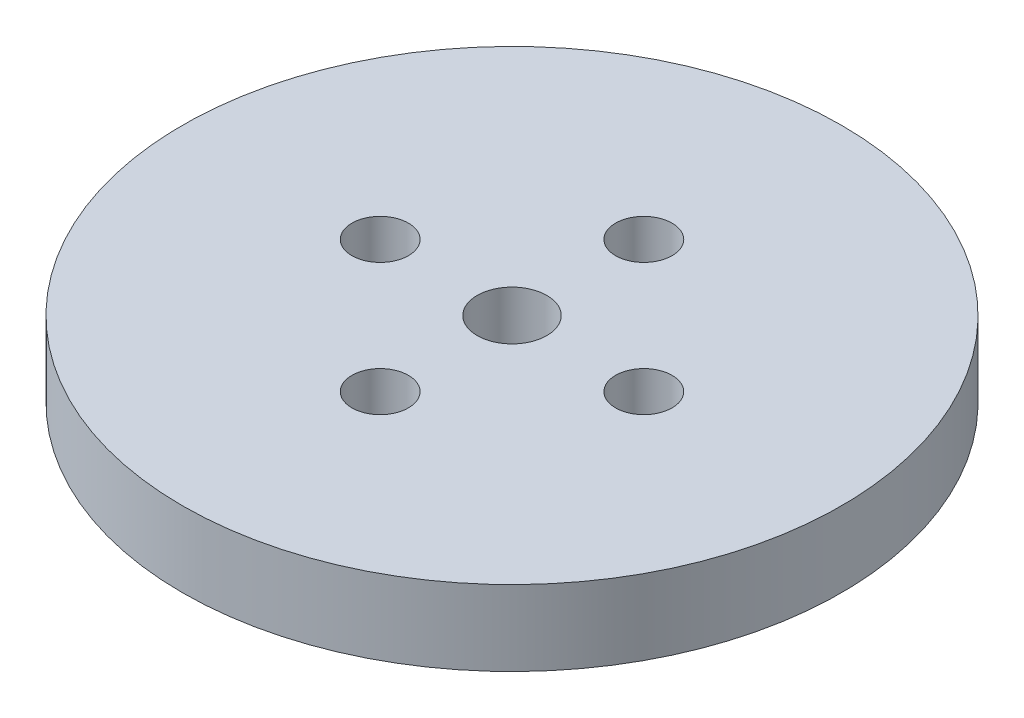
ISO-10303-21;
HEADER;
FILE_DESCRIPTION(('STEP AP214'),'2;1');
FILE_NAME('part.step','',(''),(''),'','','');
FILE_SCHEMA(('AUTOMOTIVE_DESIGN { 1 0 10303 214 1 1 1 1 }'));
ENDSEC;
DATA;
#1=APPLICATION_CONTEXT('core data for automotive mechanical design processes');
#2=APPLICATION_PROTOCOL_DEFINITION('international standard','automotive_design',2000,#1);
#3=PRODUCT_CONTEXT('',#1,'mechanical');
#4=PRODUCT('Part','Part','',(#3));
#5=PRODUCT_RELATED_PRODUCT_CATEGORY('part','',(#4));
#6=PRODUCT_DEFINITION_FORMATION('','',#4);
#7=PRODUCT_DEFINITION_CONTEXT('part definition',#1,'design');
#8=PRODUCT_DEFINITION('design','',#6,#7);
#9=PRODUCT_DEFINITION_SHAPE('','',#8);
#10=(LENGTH_UNIT() NAMED_UNIT(*) SI_UNIT(.MILLI.,.METRE.));
#11=(NAMED_UNIT(*) PLANE_ANGLE_UNIT() SI_UNIT($,.RADIAN.));
#12=(NAMED_UNIT(*) SI_UNIT($,.STERADIAN.) SOLID_ANGLE_UNIT());
#13=UNCERTAINTY_MEASURE_WITH_UNIT(LENGTH_MEASURE(1.E-05),#10,'distance_accuracy_value','');
#14=(GEOMETRIC_REPRESENTATION_CONTEXT(3) GLOBAL_UNCERTAINTY_ASSIGNED_CONTEXT((#13)) GLOBAL_UNIT_ASSIGNED_CONTEXT((#10,
#11,#12)) REPRESENTATION_CONTEXT('',''));
#15=CARTESIAN_POINT('',(0.,0.,0.));
#16=DIRECTION('',(0.,0.,1.));
#17=DIRECTION('',(1.,0.,0.));
#18=AXIS2_PLACEMENT_3D('',#15,#16,#17);
#19=CARTESIAN_POINT('',(0.,4.,0.));
#20=DIRECTION('',(0.,1.,0.));
#21=DIRECTION('',(0.,0.,1.));
#22=AXIS2_PLACEMENT_3D('',#19,#20,#21);
#23=PLANE('',#22);
#24=CARTESIAN_POINT('',(7.,4.,0.));
#25=DIRECTION('',(0.,1.,0.));
#26=DIRECTION('',(0.,0.,1.));
#27=AXIS2_PLACEMENT_3D('',#24,#25,#26);
#28=CIRCLE('',#27,1.5);
#29=CARTESIAN_POINT('',(7.,4.,1.50000000000005));
#30=VERTEX_POINT('',#29);
#31=EDGE_CURVE('E67',#30,#30,#28,.T.);
#32=ORIENTED_EDGE('',*,*,#31,.F.);
#33=EDGE_LOOP('',(#32));
#34=FACE_BOUND('',#33,.T.);
#35=CARTESIAN_POINT('',(-7.,4.,0.));
#36=DIRECTION('',(0.,1.,0.));
#37=DIRECTION('',(0.,0.,1.));
#38=AXIS2_PLACEMENT_3D('',#35,#36,#37);
#39=CIRCLE('',#38,1.5);
#40=CARTESIAN_POINT('',(-7.,4.,1.5));
#41=VERTEX_POINT('',#40);
#42=EDGE_CURVE('E55',#41,#41,#39,.T.);
#43=ORIENTED_EDGE('',*,*,#42,.F.);
#44=EDGE_LOOP('',(#43));
#45=FACE_BOUND('',#44,.T.);
#46=CARTESIAN_POINT('',(0.,4.,0.));
#47=DIRECTION('',(0.,1.,0.));
#48=DIRECTION('',(0.,0.,1.));
#49=AXIS2_PLACEMENT_3D('',#46,#47,#48);
#50=CIRCLE('',#49,17.5);
#51=CARTESIAN_POINT('',(0.,4.,17.5));
#52=VERTEX_POINT('',#51);
#53=EDGE_CURVE('E10',#52,#52,#50,.T.);
#54=ORIENTED_EDGE('',*,*,#53,.T.);
#55=EDGE_LOOP('',(#54));
#56=FACE_BOUND('',#55,.T.);
#57=CARTESIAN_POINT('',(0.,4.,0.));
#58=DIRECTION('',(0.,1.,0.));
#59=DIRECTION('',(0.,0.,1.));
#60=AXIS2_PLACEMENT_3D('',#57,#58,#59);
#61=CIRCLE('',#60,1.85);
#62=CARTESIAN_POINT('',(0.,4.,1.85));
#63=VERTEX_POINT('',#62);
#64=EDGE_CURVE('E50',#63,#63,#61,.T.);
#65=ORIENTED_EDGE('',*,*,#64,.F.);
#66=EDGE_LOOP('',(#65));
#67=FACE_BOUND('',#66,.T.);
#68=CARTESIAN_POINT('',(0.,4.,-7.));
#69=DIRECTION('',(0.,1.,0.));
#70=DIRECTION('',(0.,0.,1.));
#71=AXIS2_PLACEMENT_3D('',#68,#69,#70);
#72=CIRCLE('',#71,1.5);
#73=CARTESIAN_POINT('',(0.,4.,-5.5));
#74=VERTEX_POINT('',#73);
#75=EDGE_CURVE('E61',#74,#74,#72,.T.);
#76=ORIENTED_EDGE('',*,*,#75,.F.);
#77=EDGE_LOOP('',(#76));
#78=FACE_BOUND('',#77,.T.);
#79=CARTESIAN_POINT('',(0.,4.,7.));
#80=DIRECTION('',(0.,1.,0.));
#81=DIRECTION('',(0.,0.,1.));
#82=AXIS2_PLACEMENT_3D('',#79,#80,#81);
#83=CIRCLE('',#82,1.5);
#84=CARTESIAN_POINT('',(0.,4.,8.5));
#85=VERTEX_POINT('',#84);
#86=EDGE_CURVE('E73',#85,#85,#83,.T.);
#87=ORIENTED_EDGE('',*,*,#86,.F.);
#88=EDGE_LOOP('',(#87));
#89=FACE_BOUND('',#88,.T.);
#90=ADVANCED_FACE('F39',(#34,#45,#56,#67,#78,#89),#23,.T.);
#91=CARTESIAN_POINT('',(0.,0.,0.));
#92=DIRECTION('',(0.,1.,0.));
#93=DIRECTION('',(0.,0.,1.));
#94=AXIS2_PLACEMENT_3D('',#91,#92,#93);
#95=PLANE('',#94);
#96=CARTESIAN_POINT('',(0.,0.,0.));
#97=DIRECTION('',(0.,1.,0.));
#98=DIRECTION('',(0.,0.,1.));
#99=AXIS2_PLACEMENT_3D('',#96,#97,#98);
#100=CIRCLE('',#99,17.5);
#101=CARTESIAN_POINT('',(0.,0.,17.5));
#102=VERTEX_POINT('',#101);
#103=EDGE_CURVE('E43',#102,#102,#100,.T.);
#104=ORIENTED_EDGE('',*,*,#103,.F.);
#105=EDGE_LOOP('',(#104));
#106=FACE_BOUND('',#105,.T.);
#107=CARTESIAN_POINT('',(0.,0.,0.));
#108=DIRECTION('',(0.,1.,0.));
#109=DIRECTION('',(0.,0.,1.));
#110=AXIS2_PLACEMENT_3D('',#107,#108,#109);
#111=CIRCLE('',#110,1.85);
#112=CARTESIAN_POINT('',(0.,0.,1.85));
#113=VERTEX_POINT('',#112);
#114=EDGE_CURVE('E52',#113,#113,#111,.T.);
#115=ORIENTED_EDGE('',*,*,#114,.T.);
#116=EDGE_LOOP('',(#115));
#117=FACE_BOUND('',#116,.T.);
#118=CARTESIAN_POINT('',(-7.,0.,0.));
#119=DIRECTION('',(0.,1.,0.));
#120=DIRECTION('',(0.,0.,1.));
#121=AXIS2_PLACEMENT_3D('',#118,#119,#120);
#122=CIRCLE('',#121,1.5);
#123=CARTESIAN_POINT('',(-7.,0.,1.5));
#124=VERTEX_POINT('',#123);
#125=EDGE_CURVE('E58',#124,#124,#122,.T.);
#126=ORIENTED_EDGE('',*,*,#125,.T.);
#127=EDGE_LOOP('',(#126));
#128=FACE_BOUND('',#127,.T.);
#129=CARTESIAN_POINT('',(0.,0.,-7.));
#130=DIRECTION('',(0.,1.,0.));
#131=DIRECTION('',(0.,0.,1.));
#132=AXIS2_PLACEMENT_3D('',#129,#130,#131);
#133=CIRCLE('',#132,1.5);
#134=CARTESIAN_POINT('',(0.,0.,-5.5));
#135=VERTEX_POINT('',#134);
#136=EDGE_CURVE('E64',#135,#135,#133,.T.);
#137=ORIENTED_EDGE('',*,*,#136,.T.);
#138=EDGE_LOOP('',(#137));
#139=FACE_BOUND('',#138,.T.);
#140=CARTESIAN_POINT('',(7.,0.,0.));
#141=DIRECTION('',(0.,1.,0.));
#142=DIRECTION('',(0.,0.,1.));
#143=AXIS2_PLACEMENT_3D('',#140,#141,#142);
#144=CIRCLE('',#143,1.5);
#145=CARTESIAN_POINT('',(7.,0.,1.50000000000005));
#146=VERTEX_POINT('',#145);
#147=EDGE_CURVE('E70',#146,#146,#144,.T.);
#148=ORIENTED_EDGE('',*,*,#147,.T.);
#149=EDGE_LOOP('',(#148));
#150=FACE_BOUND('',#149,.T.);
#151=CARTESIAN_POINT('',(0.,0.,7.));
#152=DIRECTION('',(0.,1.,0.));
#153=DIRECTION('',(0.,0.,1.));
#154=AXIS2_PLACEMENT_3D('',#151,#152,#153);
#155=CIRCLE('',#154,1.5);
#156=CARTESIAN_POINT('',(0.,0.,8.5));
#157=VERTEX_POINT('',#156);
#158=EDGE_CURVE('E76',#157,#157,#155,.T.);
#159=ORIENTED_EDGE('',*,*,#158,.T.);
#160=EDGE_LOOP('',(#159));
#161=FACE_BOUND('',#160,.T.);
#162=ADVANCED_FACE('F86',(#106,#117,#128,#139,#150,#161),#95,.F.);
#163=CARTESIAN_POINT('',(0.,4.,0.));
#164=DIRECTION('',(0.,-1.,0.));
#165=DIRECTION('',(0.,0.,-1.));
#166=AXIS2_PLACEMENT_3D('',#163,#164,#165);
#167=CYLINDRICAL_SURFACE('',#166,17.5);
#168=ORIENTED_EDGE('',*,*,#53,.F.);
#169=EDGE_LOOP('',(#168));
#170=FACE_BOUND('',#169,.T.);
#171=ORIENTED_EDGE('',*,*,#103,.T.);
#172=EDGE_LOOP('',(#171));
#173=FACE_BOUND('',#172,.T.);
#174=ADVANCED_FACE('F41',(#170,#173),#167,.T.);
#175=CARTESIAN_POINT('',(0.,4.,0.));
#176=DIRECTION('',(0.,-1.,0.));
#177=DIRECTION('',(0.,0.,-1.));
#178=AXIS2_PLACEMENT_3D('',#175,#176,#177);
#179=CYLINDRICAL_SURFACE('',#178,1.85);
#180=ORIENTED_EDGE('',*,*,#64,.T.);
#181=EDGE_LOOP('',(#180));
#182=FACE_BOUND('',#181,.T.);
#183=ORIENTED_EDGE('',*,*,#114,.F.);
#184=EDGE_LOOP('',(#183));
#185=FACE_BOUND('',#184,.T.);
#186=ADVANCED_FACE('F96',(#182,#185),#179,.F.);
#187=CARTESIAN_POINT('',(-7.,4.,0.));
#188=DIRECTION('',(0.,-1.,0.));
#189=DIRECTION('',(0.,0.,-1.));
#190=AXIS2_PLACEMENT_3D('',#187,#188,#189);
#191=CYLINDRICAL_SURFACE('',#190,1.5);
#192=ORIENTED_EDGE('',*,*,#42,.T.);
#193=EDGE_LOOP('',(#192));
#194=FACE_BOUND('',#193,.T.);
#195=ORIENTED_EDGE('',*,*,#125,.F.);
#196=EDGE_LOOP('',(#195));
#197=FACE_BOUND('',#196,.T.);
#198=ADVANCED_FACE('F99',(#194,#197),#191,.F.);
#199=CARTESIAN_POINT('',(0.,4.,-7.));
#200=DIRECTION('',(0.,-1.,0.));
#201=DIRECTION('',(0.,0.,-1.));
#202=AXIS2_PLACEMENT_3D('',#199,#200,#201);
#203=CYLINDRICAL_SURFACE('',#202,1.5);
#204=ORIENTED_EDGE('',*,*,#75,.T.);
#205=EDGE_LOOP('',(#204));
#206=FACE_BOUND('',#205,.T.);
#207=ORIENTED_EDGE('',*,*,#136,.F.);
#208=EDGE_LOOP('',(#207));
#209=FACE_BOUND('',#208,.T.);
#210=ADVANCED_FACE('F103',(#206,#209),#203,.F.);
#211=CARTESIAN_POINT('',(7.,4.,0.));
#212=DIRECTION('',(0.,-1.,0.));
#213=DIRECTION('',(0.,0.,-1.));
#214=AXIS2_PLACEMENT_3D('',#211,#212,#213);
#215=CYLINDRICAL_SURFACE('',#214,1.5);
#216=ORIENTED_EDGE('',*,*,#31,.T.);
#217=EDGE_LOOP('',(#216));
#218=FACE_BOUND('',#217,.T.);
#219=ORIENTED_EDGE('',*,*,#147,.F.);
#220=EDGE_LOOP('',(#219));
#221=FACE_BOUND('',#220,.T.);
#222=ADVANCED_FACE('F107',(#218,#221),#215,.F.);
#223=CARTESIAN_POINT('',(0.,4.,7.));
#224=DIRECTION('',(0.,-1.,0.));
#225=DIRECTION('',(0.,0.,-1.));
#226=AXIS2_PLACEMENT_3D('',#223,#224,#225);
#227=CYLINDRICAL_SURFACE('',#226,1.5);
#228=ORIENTED_EDGE('',*,*,#86,.T.);
#229=EDGE_LOOP('',(#228));
#230=FACE_BOUND('',#229,.T.);
#231=ORIENTED_EDGE('',*,*,#158,.F.);
#232=EDGE_LOOP('',(#231));
#233=FACE_BOUND('',#232,.T.);
#234=ADVANCED_FACE('F82',(#230,#233),#227,.F.);
#235=CLOSED_SHELL('',(#90,#162,#174,#186,#198,#210,#222,#234));
#236=MANIFOLD_SOLID_BREP('B2',#235);
#237=ADVANCED_BREP_SHAPE_REPRESENTATION('',(#18,#236),#14);
#238=SHAPE_DEFINITION_REPRESENTATION(#9,#237);
ENDSEC;
END-ISO-10303-21;
